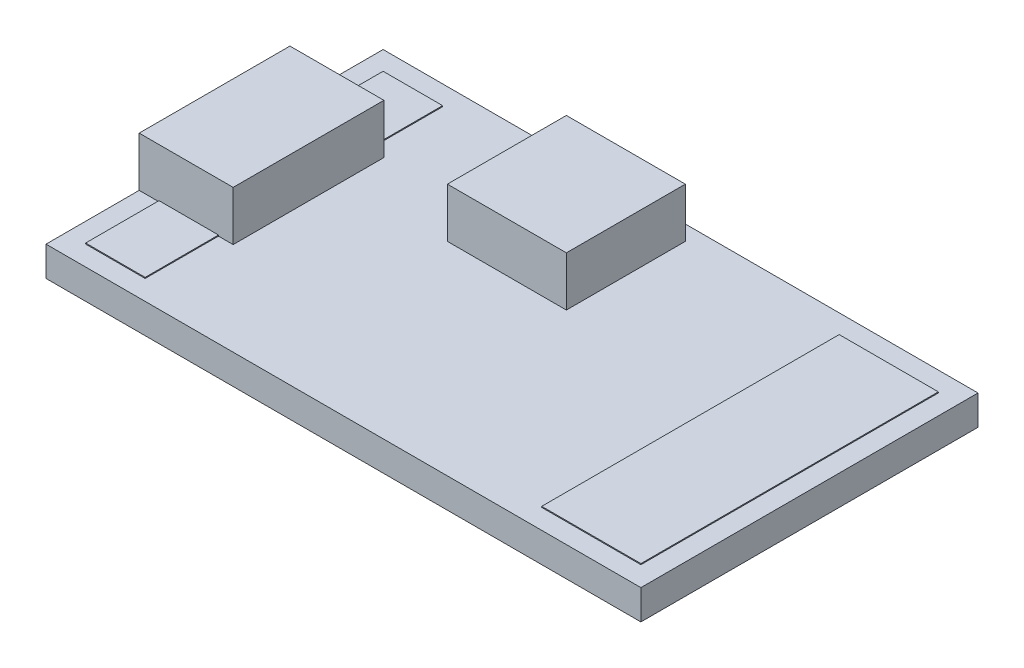
ISO-10303-21;
HEADER;
FILE_DESCRIPTION(('STEP AP214'),'2;1');
FILE_NAME('part.step','',(''),(''),'','','');
FILE_SCHEMA(('AUTOMOTIVE_DESIGN { 1 0 10303 214 1 1 1 1 }'));
ENDSEC;
DATA;
#1=APPLICATION_CONTEXT('core data for automotive mechanical design processes');
#2=APPLICATION_PROTOCOL_DEFINITION('international standard','automotive_design',2000,#1);
#3=PRODUCT_CONTEXT('',#1,'mechanical');
#4=PRODUCT('Part','Part','',(#3));
#5=PRODUCT_RELATED_PRODUCT_CATEGORY('part','',(#4));
#6=PRODUCT_DEFINITION_FORMATION('','',#4);
#7=PRODUCT_DEFINITION_CONTEXT('part definition',#1,'design');
#8=PRODUCT_DEFINITION('design','',#6,#7);
#9=PRODUCT_DEFINITION_SHAPE('','',#8);
#10=(LENGTH_UNIT() NAMED_UNIT(*) SI_UNIT(.MILLI.,.METRE.));
#11=(NAMED_UNIT(*) PLANE_ANGLE_UNIT() SI_UNIT($,.RADIAN.));
#12=(NAMED_UNIT(*) SI_UNIT($,.STERADIAN.) SOLID_ANGLE_UNIT());
#13=UNCERTAINTY_MEASURE_WITH_UNIT(LENGTH_MEASURE(1.E-05),#10,'distance_accuracy_value','');
#14=(GEOMETRIC_REPRESENTATION_CONTEXT(3) GLOBAL_UNCERTAINTY_ASSIGNED_CONTEXT((#13)) GLOBAL_UNIT_ASSIGNED_CONTEXT((#10,
#11,#12)) REPRESENTATION_CONTEXT('',''));
#15=CARTESIAN_POINT('',(0.,0.,0.));
#16=DIRECTION('',(0.,0.,1.));
#17=DIRECTION('',(1.,0.,0.));
#18=AXIS2_PLACEMENT_3D('',#15,#16,#17);
#19=CARTESIAN_POINT('',(0.,1.5,0.));
#20=DIRECTION('',(0.,-1.,0.));
#21=DIRECTION('',(0.,0.,-1.));
#22=AXIS2_PLACEMENT_3D('',#19,#20,#21);
#23=PLANE('',#22);
#24=DIRECTION('',(0.,0.,1.));
#25=VECTOR('',#24,1.);
#26=CARTESIAN_POINT('',(-20.,1.5,0.));
#27=LINE('',#26,#25);
#28=CARTESIAN_POINT('',(-20.,1.5,-7.74139549739495));
#29=VERTEX_POINT('',#28);
#30=CARTESIAN_POINT('',(-20.,1.5,-1.74139549739495));
#31=VERTEX_POINT('',#30);
#32=EDGE_CURVE('E344',#29,#31,#27,.T.);
#33=ORIENTED_EDGE('',*,*,#32,.F.);
#34=DIRECTION('',(-1.,0.,0.));
#35=VECTOR('',#34,1.);
#36=CARTESIAN_POINT('',(0.,1.5,-7.74139549739495));
#37=LINE('',#36,#35);
#38=CARTESIAN_POINT('',(-14.,1.5,-7.74139549739495));
#39=VERTEX_POINT('',#38);
#40=EDGE_CURVE('E335',#39,#29,#37,.T.);
#41=ORIENTED_EDGE('',*,*,#40,.F.);
#42=DIRECTION('',(0.,0.,-1.));
#43=VECTOR('',#42,1.);
#44=CARTESIAN_POINT('',(-14.,1.5,0.));
#45=LINE('',#44,#43);
#46=CARTESIAN_POINT('',(-14.,1.5,-1.74139549739495));
#47=VERTEX_POINT('',#46);
#48=EDGE_CURVE('E338',#47,#39,#45,.T.);
#49=ORIENTED_EDGE('',*,*,#48,.F.);
#50=DIRECTION('',(1.,0.,0.));
#51=VECTOR('',#50,1.);
#52=CARTESIAN_POINT('',(0.,1.5,-1.74139549739495));
#53=LINE('',#52,#51);
#54=EDGE_CURVE('E341',#31,#47,#53,.T.);
#55=ORIENTED_EDGE('',*,*,#54,.F.);
#56=EDGE_LOOP('',(#33,#41,#49,#55));
#57=FACE_BOUND('',#56,.T.);
#58=DIRECTION('',(1.,0.,0.));
#59=VECTOR('',#58,1.);
#60=CARTESIAN_POINT('',(0.,1.5,7.5));
#61=LINE('',#60,#59);
#62=CARTESIAN_POINT('',(-6.,1.5,7.5));
#63=VERTEX_POINT('',#62);
#64=CARTESIAN_POINT('',(-1.,1.5,7.5));
#65=VERTEX_POINT('',#64);
#66=EDGE_CURVE('E279',#63,#65,#61,.T.);
#67=ORIENTED_EDGE('',*,*,#66,.F.);
#68=DIRECTION('',(0.,0.,1.));
#69=VECTOR('',#68,1.);
#70=CARTESIAN_POINT('',(-6.,1.5,0.));
#71=LINE('',#70,#69);
#72=CARTESIAN_POINT('',(-6.,1.5,-7.5));
#73=VERTEX_POINT('',#72);
#74=EDGE_CURVE('E276',#73,#63,#71,.T.);
#75=ORIENTED_EDGE('',*,*,#74,.F.);
#76=DIRECTION('',(-1.,0.,0.));
#77=VECTOR('',#76,1.);
#78=CARTESIAN_POINT('',(0.,1.5,-7.5));
#79=LINE('',#78,#77);
#80=CARTESIAN_POINT('',(-1.,1.5,-7.5));
#81=VERTEX_POINT('',#80);
#82=EDGE_CURVE('E273',#81,#73,#79,.T.);
#83=ORIENTED_EDGE('',*,*,#82,.F.);
#84=DIRECTION('',(0.,0.,-1.));
#85=VECTOR('',#84,1.);
#86=CARTESIAN_POINT('',(-1.,1.5,0.));
#87=LINE('',#86,#85);
#88=EDGE_CURVE('E257',#65,#81,#87,.T.);
#89=ORIENTED_EDGE('',*,*,#88,.F.);
#90=EDGE_LOOP('',(#67,#75,#83,#89));
#91=FACE_BOUND('',#90,.T.);
#92=DIRECTION('',(0.,0.,-1.));
#93=VECTOR('',#92,1.);
#94=CARTESIAN_POINT('',(-26.,1.5,0.));
#95=LINE('',#94,#93);
#96=CARTESIAN_POINT('',(-26.,1.5,-3.80167065449123));
#97=VERTEX_POINT('',#96);
#98=CARTESIAN_POINT('',(-26.,1.5,-7.5));
#99=VERTEX_POINT('',#98);
#100=EDGE_CURVE('E215',#97,#99,#95,.T.);
#101=ORIENTED_EDGE('',*,*,#100,.F.);
#102=DIRECTION('',(-1.,0.,0.));
#103=VECTOR('',#102,1.);
#104=CARTESIAN_POINT('',(0.,1.5,-3.80167065449122));
#105=LINE('',#104,#103);
#106=CARTESIAN_POINT('',(-25.2605356148663,1.5,-3.80167065449123));
#107=VERTEX_POINT('',#106);
#108=EDGE_CURVE('E304',#107,#97,#105,.T.);
#109=ORIENTED_EDGE('',*,*,#108,.F.);
#110=DIRECTION('',(0.,0.,-1.));
#111=VECTOR('',#110,1.);
#112=CARTESIAN_POINT('',(-25.2605356148663,1.5,0.));
#113=LINE('',#112,#111);
#114=CARTESIAN_POINT('',(-25.2605356148663,1.5,3.80167065449123));
#115=VERTEX_POINT('',#114);
#116=EDGE_CURVE('E307',#115,#107,#113,.T.);
#117=ORIENTED_EDGE('',*,*,#116,.F.);
#118=DIRECTION('',(1.,0.,0.));
#119=VECTOR('',#118,1.);
#120=CARTESIAN_POINT('',(0.,1.5,3.80167065449122));
#121=LINE('',#120,#119);
#122=CARTESIAN_POINT('',(-26.,1.5,3.80167065449123));
#123=VERTEX_POINT('',#122);
#124=EDGE_CURVE('E310',#123,#115,#121,.T.);
#125=ORIENTED_EDGE('',*,*,#124,.F.);
#126=CARTESIAN_POINT('',(-26.,1.5,7.50000000000001));
#127=VERTEX_POINT('',#126);
#128=EDGE_CURVE('E239',#127,#123,#95,.T.);
#129=ORIENTED_EDGE('',*,*,#128,.F.);
#130=DIRECTION('',(1.,0.,0.));
#131=VECTOR('',#130,1.);
#132=CARTESIAN_POINT('',(0.,1.5,7.50000000000001));
#133=LINE('',#132,#131);
#134=CARTESIAN_POINT('',(-29.,1.5,7.50000000000001));
#135=VERTEX_POINT('',#134);
#136=EDGE_CURVE('E242',#135,#127,#133,.T.);
#137=ORIENTED_EDGE('',*,*,#136,.F.);
#138=DIRECTION('',(0.,0.,1.));
#139=VECTOR('',#138,1.);
#140=CARTESIAN_POINT('',(-29.,1.5,0.));
#141=LINE('',#140,#139);
#142=CARTESIAN_POINT('',(-29.,1.5,3.80167065449123));
#143=VERTEX_POINT('',#142);
#144=EDGE_CURVE('E234',#143,#135,#141,.T.);
#145=ORIENTED_EDGE('',*,*,#144,.F.);
#146=CARTESIAN_POINT('',(-30.,1.5,3.80167065449123));
#147=VERTEX_POINT('',#146);
#148=EDGE_CURVE('E311',#147,#143,#121,.T.);
#149=ORIENTED_EDGE('',*,*,#148,.F.);
#150=DIRECTION('',(0.,0.,1.));
#151=VECTOR('',#150,1.);
#152=CARTESIAN_POINT('',(-30.,1.5,-8.49999999999999));
#153=LINE('',#152,#151);
#154=CARTESIAN_POINT('',(-30.,1.5,8.5));
#155=VERTEX_POINT('',#154);
#156=EDGE_CURVE('E354',#147,#155,#153,.T.);
#157=ORIENTED_EDGE('',*,*,#156,.T.);
#158=DIRECTION('',(1.,0.,0.));
#159=VECTOR('',#158,1.);
#160=CARTESIAN_POINT('',(0.,1.5,8.5));
#161=LINE('',#160,#159);
#162=CARTESIAN_POINT('',(0.,1.5,8.5));
#163=VERTEX_POINT('',#162);
#164=EDGE_CURVE('E358',#155,#163,#161,.T.);
#165=ORIENTED_EDGE('',*,*,#164,.T.);
#166=DIRECTION('',(0.,0.,-1.));
#167=VECTOR('',#166,1.);
#168=CARTESIAN_POINT('',(0.,1.5,-8.5));
#169=LINE('',#168,#167);
#170=CARTESIAN_POINT('',(0.,1.5,-8.5));
#171=VERTEX_POINT('',#170);
#172=EDGE_CURVE('E348',#163,#171,#169,.T.);
#173=ORIENTED_EDGE('',*,*,#172,.T.);
#174=DIRECTION('',(-1.,0.,0.));
#175=VECTOR('',#174,1.);
#176=CARTESIAN_POINT('',(0.,1.5,-8.5));
#177=LINE('',#176,#175);
#178=CARTESIAN_POINT('',(-30.,1.5,-8.49999999999999));
#179=VERTEX_POINT('',#178);
#180=EDGE_CURVE('E351',#171,#179,#177,.T.);
#181=ORIENTED_EDGE('',*,*,#180,.T.);
#182=CARTESIAN_POINT('',(-30.,1.5,-3.80167065449123));
#183=VERTEX_POINT('',#182);
#184=EDGE_CURVE('E355',#179,#183,#153,.T.);
#185=ORIENTED_EDGE('',*,*,#184,.T.);
#186=CARTESIAN_POINT('',(-29.,1.5,-3.80167065449123));
#187=VERTEX_POINT('',#186);
#188=EDGE_CURVE('E303',#187,#183,#105,.T.);
#189=ORIENTED_EDGE('',*,*,#188,.F.);
#190=CARTESIAN_POINT('',(-29.,1.5,-7.5));
#191=VERTEX_POINT('',#190);
#192=EDGE_CURVE('E59',#191,#187,#141,.T.);
#193=ORIENTED_EDGE('',*,*,#192,.F.);
#194=DIRECTION('',(-1.,0.,0.));
#195=VECTOR('',#194,1.);
#196=CARTESIAN_POINT('',(0.,1.5,-7.5));
#197=LINE('',#196,#195);
#198=EDGE_CURVE('E54',#99,#191,#197,.T.);
#199=ORIENTED_EDGE('',*,*,#198,.F.);
#200=EDGE_LOOP('',(#101,#109,#117,#125,#129,#137,#145,#149,#157,#165,#173,#181,#185,#189,#193,#199));
#201=FACE_BOUND('',#200,.T.);
#202=ADVANCED_FACE('F39',(#57,#91,#201),#23,.F.);
#203=CARTESIAN_POINT('',(-30.,4.,3.80167065449123));
#204=DIRECTION('',(0.,0.,-1.));
#205=DIRECTION('',(-1.,0.,0.));
#206=AXIS2_PLACEMENT_3D('',#203,#204,#205);
#207=PLANE('',#206);
#208=DIRECTION('',(0.,1.,0.));
#209=VECTOR('',#208,1.);
#210=CARTESIAN_POINT('',(-26.,4.,3.80167065449123));
#211=LINE('',#210,#209);
#212=CARTESIAN_POINT('',(-26.,1.55,3.80167065449123));
#213=VERTEX_POINT('',#212);
#214=EDGE_CURVE('E238',#123,#213,#211,.T.);
#215=ORIENTED_EDGE('',*,*,#214,.F.);
#216=ORIENTED_EDGE('',*,*,#124,.T.);
#217=DIRECTION('',(0.,-1.,0.));
#218=VECTOR('',#217,1.);
#219=CARTESIAN_POINT('',(-25.2605356148663,4.,3.80167065449123));
#220=LINE('',#219,#218);
#221=CARTESIAN_POINT('',(-25.2605356148663,4.,3.80167065449123));
#222=VERTEX_POINT('',#221);
#223=EDGE_CURVE('E297',#222,#115,#220,.T.);
#224=ORIENTED_EDGE('',*,*,#223,.F.);
#225=DIRECTION('',(1.,0.,0.));
#226=VECTOR('',#225,1.);
#227=CARTESIAN_POINT('',(-30.,4.,3.80167065449123));
#228=LINE('',#227,#226);
#229=CARTESIAN_POINT('',(-30.,4.,3.80167065449123));
#230=VERTEX_POINT('',#229);
#231=EDGE_CURVE('E285',#230,#222,#228,.T.);
#232=ORIENTED_EDGE('',*,*,#231,.F.);
#233=DIRECTION('',(0.,-1.,0.));
#234=VECTOR('',#233,1.);
#235=CARTESIAN_POINT('',(-30.,4.,3.80167065449123));
#236=LINE('',#235,#234);
#237=EDGE_CURVE('E300',#230,#147,#236,.T.);
#238=ORIENTED_EDGE('',*,*,#237,.T.);
#239=ORIENTED_EDGE('',*,*,#148,.T.);
#240=DIRECTION('',(0.,-1.,0.));
#241=VECTOR('',#240,1.);
#242=CARTESIAN_POINT('',(-29.,4.,3.80167065449123));
#243=LINE('',#242,#241);
#244=CARTESIAN_POINT('',(-29.,1.55,3.80167065449123));
#245=VERTEX_POINT('',#244);
#246=EDGE_CURVE('E233',#245,#143,#243,.T.);
#247=ORIENTED_EDGE('',*,*,#246,.F.);
#248=DIRECTION('',(-1.,0.,0.));
#249=VECTOR('',#248,1.);
#250=CARTESIAN_POINT('',(-30.,1.55,3.80167065449123));
#251=LINE('',#250,#249);
#252=EDGE_CURVE('E228',#213,#245,#251,.T.);
#253=ORIENTED_EDGE('',*,*,#252,.F.);
#254=EDGE_LOOP('',(#215,#216,#224,#232,#238,#239,#247,#253));
#255=FACE_BOUND('',#254,.T.);
#256=ADVANCED_FACE('F404',(#255),#207,.F.);
#257=CARTESIAN_POINT('',(-30.,4.,-3.80167065449123));
#258=DIRECTION('',(0.,0.,1.));
#259=DIRECTION('',(1.,0.,0.));
#260=AXIS2_PLACEMENT_3D('',#257,#258,#259);
#261=PLANE('',#260);
#262=DIRECTION('',(0.,-1.,0.));
#263=VECTOR('',#262,1.);
#264=CARTESIAN_POINT('',(-26.,4.,-3.80167065449123));
#265=LINE('',#264,#263);
#266=CARTESIAN_POINT('',(-26.,1.55,-3.80167065449123));
#267=VERTEX_POINT('',#266);
#268=EDGE_CURVE('E12',#267,#97,#265,.T.);
#269=ORIENTED_EDGE('',*,*,#268,.F.);
#270=DIRECTION('',(1.,0.,0.));
#271=VECTOR('',#270,1.);
#272=CARTESIAN_POINT('',(-30.,1.55,-3.80167065449123));
#273=LINE('',#272,#271);
#274=CARTESIAN_POINT('',(-29.,1.55,-3.80167065449123));
#275=VERTEX_POINT('',#274);
#276=EDGE_CURVE('E207',#275,#267,#273,.T.);
#277=ORIENTED_EDGE('',*,*,#276,.F.);
#278=DIRECTION('',(0.,1.,0.));
#279=VECTOR('',#278,1.);
#280=CARTESIAN_POINT('',(-29.,4.,-3.80167065449123));
#281=LINE('',#280,#279);
#282=EDGE_CURVE('E47',#187,#275,#281,.T.);
#283=ORIENTED_EDGE('',*,*,#282,.F.);
#284=ORIENTED_EDGE('',*,*,#188,.T.);
#285=DIRECTION('',(0.,-1.,0.));
#286=VECTOR('',#285,1.);
#287=CARTESIAN_POINT('',(-30.,4.,-3.80167065449123));
#288=LINE('',#287,#286);
#289=CARTESIAN_POINT('',(-30.,4.,-3.80167065449123));
#290=VERTEX_POINT('',#289);
#291=EDGE_CURVE('E291',#290,#183,#288,.T.);
#292=ORIENTED_EDGE('',*,*,#291,.F.);
#293=DIRECTION('',(-1.,0.,0.));
#294=VECTOR('',#293,1.);
#295=CARTESIAN_POINT('',(-30.,4.,-3.80167065449123));
#296=LINE('',#295,#294);
#297=CARTESIAN_POINT('',(-25.2605356148663,4.,-3.80167065449123));
#298=VERTEX_POINT('',#297);
#299=EDGE_CURVE('E289',#298,#290,#296,.T.);
#300=ORIENTED_EDGE('',*,*,#299,.F.);
#301=DIRECTION('',(0.,-1.,0.));
#302=VECTOR('',#301,1.);
#303=CARTESIAN_POINT('',(-25.2605356148663,4.,-3.80167065449123));
#304=LINE('',#303,#302);
#305=EDGE_CURVE('E294',#298,#107,#304,.T.);
#306=ORIENTED_EDGE('',*,*,#305,.T.);
#307=ORIENTED_EDGE('',*,*,#108,.T.);
#308=EDGE_LOOP('',(#269,#277,#283,#284,#292,#300,#306,#307));
#309=FACE_BOUND('',#308,.T.);
#310=ADVANCED_FACE('F422',(#309),#261,.F.);
#311=CARTESIAN_POINT('',(0.,1.5,-8.5));
#312=DIRECTION('',(-1.,0.,0.));
#313=DIRECTION('',(0.,0.,1.));
#314=AXIS2_PLACEMENT_3D('',#311,#312,#313);
#315=PLANE('',#314);
#316=DIRECTION('',(0.,0.,-1.));
#317=VECTOR('',#316,1.);
#318=CARTESIAN_POINT('',(0.,0.,-8.5));
#319=LINE('',#318,#317);
#320=CARTESIAN_POINT('',(0.,0.,8.5));
#321=VERTEX_POINT('',#320);
#322=CARTESIAN_POINT('',(0.,0.,-8.5));
#323=VERTEX_POINT('',#322);
#324=EDGE_CURVE('E347',#321,#323,#319,.T.);
#325=ORIENTED_EDGE('',*,*,#324,.T.);
#326=DIRECTION('',(0.,-1.,0.));
#327=VECTOR('',#326,1.);
#328=CARTESIAN_POINT('',(0.,1.5,-8.5));
#329=LINE('',#328,#327);
#330=EDGE_CURVE('E376',#171,#323,#329,.T.);
#331=ORIENTED_EDGE('',*,*,#330,.F.);
#332=ORIENTED_EDGE('',*,*,#172,.F.);
#333=DIRECTION('',(0.,-1.,0.));
#334=VECTOR('',#333,1.);
#335=CARTESIAN_POINT('',(0.,1.5,8.5));
#336=LINE('',#335,#334);
#337=EDGE_CURVE('E360',#163,#321,#336,.T.);
#338=ORIENTED_EDGE('',*,*,#337,.T.);
#339=EDGE_LOOP('',(#325,#331,#332,#338));
#340=FACE_BOUND('',#339,.T.);
#341=ADVANCED_FACE('F41',(#340),#315,.F.);
#342=CARTESIAN_POINT('',(0.,1.5,-8.5));
#343=DIRECTION('',(0.,0.,1.));
#344=DIRECTION('',(1.,0.,0.));
#345=AXIS2_PLACEMENT_3D('',#342,#343,#344);
#346=PLANE('',#345);
#347=DIRECTION('',(-1.,0.,0.));
#348=VECTOR('',#347,1.);
#349=CARTESIAN_POINT('',(0.,0.,-8.5));
#350=LINE('',#349,#348);
#351=CARTESIAN_POINT('',(-30.,0.,-8.49999999999999));
#352=VERTEX_POINT('',#351);
#353=EDGE_CURVE('E363',#323,#352,#350,.T.);
#354=ORIENTED_EDGE('',*,*,#353,.T.);
#355=DIRECTION('',(0.,-1.,0.));
#356=VECTOR('',#355,1.);
#357=CARTESIAN_POINT('',(-30.,1.5,-8.49999999999999));
#358=LINE('',#357,#356);
#359=EDGE_CURVE('E373',#179,#352,#358,.T.);
#360=ORIENTED_EDGE('',*,*,#359,.F.);
#361=ORIENTED_EDGE('',*,*,#180,.F.);
#362=ORIENTED_EDGE('',*,*,#330,.T.);
#363=EDGE_LOOP('',(#354,#360,#361,#362));
#364=FACE_BOUND('',#363,.T.);
#365=ADVANCED_FACE('F439',(#364),#346,.F.);
#366=CARTESIAN_POINT('',(-30.,1.5,-8.49999999999999));
#367=DIRECTION('',(1.,0.,0.));
#368=DIRECTION('',(0.,0.,-1.));
#369=AXIS2_PLACEMENT_3D('',#366,#367,#368);
#370=PLANE('',#369);
#371=DIRECTION('',(0.,0.,1.));
#372=VECTOR('',#371,1.);
#373=CARTESIAN_POINT('',(-30.,0.,-8.49999999999999));
#374=LINE('',#373,#372);
#375=CARTESIAN_POINT('',(-30.,0.,8.5));
#376=VERTEX_POINT('',#375);
#377=EDGE_CURVE('E365',#352,#376,#374,.T.);
#378=ORIENTED_EDGE('',*,*,#377,.T.);
#379=DIRECTION('',(0.,-1.,0.));
#380=VECTOR('',#379,1.);
#381=CARTESIAN_POINT('',(-30.,1.5,8.5));
#382=LINE('',#381,#380);
#383=EDGE_CURVE('E370',#155,#376,#382,.T.);
#384=ORIENTED_EDGE('',*,*,#383,.F.);
#385=ORIENTED_EDGE('',*,*,#156,.F.);
#386=ORIENTED_EDGE('',*,*,#237,.F.);
#387=DIRECTION('',(0.,0.,1.));
#388=VECTOR('',#387,1.);
#389=CARTESIAN_POINT('',(-30.,4.,-3.80167065449123));
#390=LINE('',#389,#388);
#391=EDGE_CURVE('E282',#290,#230,#390,.T.);
#392=ORIENTED_EDGE('',*,*,#391,.F.);
#393=ORIENTED_EDGE('',*,*,#291,.T.);
#394=ORIENTED_EDGE('',*,*,#184,.F.);
#395=ORIENTED_EDGE('',*,*,#359,.T.);
#396=EDGE_LOOP('',(#378,#384,#385,#386,#392,#393,#394,#395));
#397=FACE_BOUND('',#396,.T.);
#398=ADVANCED_FACE('F436',(#397),#370,.F.);
#399=CARTESIAN_POINT('',(0.,1.5,8.5));
#400=DIRECTION('',(0.,0.,-1.));
#401=DIRECTION('',(-1.,0.,0.));
#402=AXIS2_PLACEMENT_3D('',#399,#400,#401);
#403=PLANE('',#402);
#404=DIRECTION('',(1.,0.,0.));
#405=VECTOR('',#404,1.);
#406=CARTESIAN_POINT('',(0.,0.,8.5));
#407=LINE('',#406,#405);
#408=EDGE_CURVE('E352',#376,#321,#407,.T.);
#409=ORIENTED_EDGE('',*,*,#408,.T.);
#410=ORIENTED_EDGE('',*,*,#337,.F.);
#411=ORIENTED_EDGE('',*,*,#164,.F.);
#412=ORIENTED_EDGE('',*,*,#383,.T.);
#413=EDGE_LOOP('',(#409,#410,#411,#412));
#414=FACE_BOUND('',#413,.T.);
#415=ADVANCED_FACE('F432',(#414),#403,.F.);
#416=CARTESIAN_POINT('',(0.,0.,0.));
#417=DIRECTION('',(0.,-1.,0.));
#418=DIRECTION('',(0.,0.,-1.));
#419=AXIS2_PLACEMENT_3D('',#416,#417,#418);
#420=PLANE('',#419);
#421=ORIENTED_EDGE('',*,*,#408,.F.);
#422=ORIENTED_EDGE('',*,*,#377,.F.);
#423=ORIENTED_EDGE('',*,*,#353,.F.);
#424=ORIENTED_EDGE('',*,*,#324,.F.);
#425=EDGE_LOOP('',(#421,#422,#423,#424));
#426=FACE_BOUND('',#425,.T.);
#427=ADVANCED_FACE('F429',(#426),#420,.T.);
#428=CARTESIAN_POINT('',(-20.,4.,-7.74139549739495));
#429=DIRECTION('',(1.,0.,0.));
#430=DIRECTION('',(0.,0.,-1.));
#431=AXIS2_PLACEMENT_3D('',#428,#429,#430);
#432=PLANE('',#431);
#433=DIRECTION('',(0.,-1.,0.));
#434=VECTOR('',#433,1.);
#435=CARTESIAN_POINT('',(-20.,4.,-7.74139549739495));
#436=LINE('',#435,#434);
#437=CARTESIAN_POINT('',(-20.,4.,-7.74139549739495));
#438=VERTEX_POINT('',#437);
#439=EDGE_CURVE('E323',#438,#29,#436,.T.);
#440=ORIENTED_EDGE('',*,*,#439,.T.);
#441=ORIENTED_EDGE('',*,*,#32,.T.);
#442=DIRECTION('',(0.,-1.,0.));
#443=VECTOR('',#442,1.);
#444=CARTESIAN_POINT('',(-20.,4.,-1.74139549739495));
#445=LINE('',#444,#443);
#446=CARTESIAN_POINT('',(-20.,4.,-1.74139549739495));
#447=VERTEX_POINT('',#446);
#448=EDGE_CURVE('E332',#447,#31,#445,.T.);
#449=ORIENTED_EDGE('',*,*,#448,.F.);
#450=DIRECTION('',(0.,0.,1.));
#451=VECTOR('',#450,1.);
#452=CARTESIAN_POINT('',(-20.,4.,-7.74139549739495));
#453=LINE('',#452,#451);
#454=EDGE_CURVE('E314',#438,#447,#453,.T.);
#455=ORIENTED_EDGE('',*,*,#454,.F.);
#456=EDGE_LOOP('',(#440,#441,#449,#455));
#457=FACE_BOUND('',#456,.T.);
#458=ADVANCED_FACE('F427',(#457),#432,.F.);
#459=CARTESIAN_POINT('',(-20.,4.,-1.74139549739495));
#460=DIRECTION('',(0.,0.,-1.));
#461=DIRECTION('',(-1.,0.,0.));
#462=AXIS2_PLACEMENT_3D('',#459,#460,#461);
#463=PLANE('',#462);
#464=ORIENTED_EDGE('',*,*,#448,.T.);
#465=ORIENTED_EDGE('',*,*,#54,.T.);
#466=DIRECTION('',(0.,-1.,0.));
#467=VECTOR('',#466,1.);
#468=CARTESIAN_POINT('',(-14.,4.,-1.74139549739495));
#469=LINE('',#468,#467);
#470=CARTESIAN_POINT('',(-14.,4.,-1.74139549739495));
#471=VERTEX_POINT('',#470);
#472=EDGE_CURVE('E329',#471,#47,#469,.T.);
#473=ORIENTED_EDGE('',*,*,#472,.F.);
#474=DIRECTION('',(1.,0.,0.));
#475=VECTOR('',#474,1.);
#476=CARTESIAN_POINT('',(-20.,4.,-1.74139549739495));
#477=LINE('',#476,#475);
#478=EDGE_CURVE('E317',#447,#471,#477,.T.);
#479=ORIENTED_EDGE('',*,*,#478,.F.);
#480=EDGE_LOOP('',(#464,#465,#473,#479));
#481=FACE_BOUND('',#480,.T.);
#482=ADVANCED_FACE('F489',(#481),#463,.F.);
#483=CARTESIAN_POINT('',(-14.,4.,-7.74139549739495));
#484=DIRECTION('',(-1.,0.,0.));
#485=DIRECTION('',(0.,0.,1.));
#486=AXIS2_PLACEMENT_3D('',#483,#484,#485);
#487=PLANE('',#486);
#488=ORIENTED_EDGE('',*,*,#472,.T.);
#489=ORIENTED_EDGE('',*,*,#48,.T.);
#490=DIRECTION('',(0.,-1.,0.));
#491=VECTOR('',#490,1.);
#492=CARTESIAN_POINT('',(-14.,4.,-7.74139549739495));
#493=LINE('',#492,#491);
#494=CARTESIAN_POINT('',(-14.,4.,-7.74139549739495));
#495=VERTEX_POINT('',#494);
#496=EDGE_CURVE('E326',#495,#39,#493,.T.);
#497=ORIENTED_EDGE('',*,*,#496,.F.);
#498=DIRECTION('',(0.,0.,-1.));
#499=VECTOR('',#498,1.);
#500=CARTESIAN_POINT('',(-14.,4.,-7.74139549739495));
#501=LINE('',#500,#499);
#502=EDGE_CURVE('E319',#471,#495,#501,.T.);
#503=ORIENTED_EDGE('',*,*,#502,.F.);
#504=EDGE_LOOP('',(#488,#489,#497,#503));
#505=FACE_BOUND('',#504,.T.);
#506=ADVANCED_FACE('F486',(#505),#487,.F.);
#507=CARTESIAN_POINT('',(-20.,4.,-7.74139549739495));
#508=DIRECTION('',(0.,0.,1.));
#509=DIRECTION('',(1.,0.,0.));
#510=AXIS2_PLACEMENT_3D('',#507,#508,#509);
#511=PLANE('',#510);
#512=ORIENTED_EDGE('',*,*,#496,.T.);
#513=ORIENTED_EDGE('',*,*,#40,.T.);
#514=ORIENTED_EDGE('',*,*,#439,.F.);
#515=DIRECTION('',(-1.,0.,0.));
#516=VECTOR('',#515,1.);
#517=CARTESIAN_POINT('',(-20.,4.,-7.74139549739495));
#518=LINE('',#517,#516);
#519=EDGE_CURVE('E321',#495,#438,#518,.T.);
#520=ORIENTED_EDGE('',*,*,#519,.F.);
#521=EDGE_LOOP('',(#512,#513,#514,#520));
#522=FACE_BOUND('',#521,.T.);
#523=ADVANCED_FACE('F479',(#522),#511,.F.);
#524=CARTESIAN_POINT('',(0.,4.,0.));
#525=DIRECTION('',(0.,1.,0.));
#526=DIRECTION('',(0.,0.,1.));
#527=AXIS2_PLACEMENT_3D('',#524,#525,#526);
#528=PLANE('',#527);
#529=ORIENTED_EDGE('',*,*,#454,.T.);
#530=ORIENTED_EDGE('',*,*,#478,.T.);
#531=ORIENTED_EDGE('',*,*,#502,.T.);
#532=ORIENTED_EDGE('',*,*,#519,.T.);
#533=EDGE_LOOP('',(#529,#530,#531,#532));
#534=FACE_BOUND('',#533,.T.);
#535=ADVANCED_FACE('F471',(#534),#528,.T.);
#536=CARTESIAN_POINT('',(-25.2605356148663,4.,-3.80167065449123));
#537=DIRECTION('',(-1.,0.,0.));
#538=DIRECTION('',(0.,0.,1.));
#539=AXIS2_PLACEMENT_3D('',#536,#537,#538);
#540=PLANE('',#539);
#541=ORIENTED_EDGE('',*,*,#223,.T.);
#542=ORIENTED_EDGE('',*,*,#116,.T.);
#543=ORIENTED_EDGE('',*,*,#305,.F.);
#544=DIRECTION('',(0.,0.,-1.));
#545=VECTOR('',#544,1.);
#546=CARTESIAN_POINT('',(-25.2605356148663,4.,-3.80167065449123));
#547=LINE('',#546,#545);
#548=EDGE_CURVE('E287',#222,#298,#547,.T.);
#549=ORIENTED_EDGE('',*,*,#548,.F.);
#550=EDGE_LOOP('',(#541,#542,#543,#549));
#551=FACE_BOUND('',#550,.T.);
#552=ADVANCED_FACE('F468',(#551),#540,.F.);
#553=CARTESIAN_POINT('',(0.,4.,0.));
#554=DIRECTION('',(0.,1.,0.));
#555=DIRECTION('',(0.,0.,1.));
#556=AXIS2_PLACEMENT_3D('',#553,#554,#555);
#557=PLANE('',#556);
#558=ORIENTED_EDGE('',*,*,#391,.T.);
#559=ORIENTED_EDGE('',*,*,#231,.T.);
#560=ORIENTED_EDGE('',*,*,#548,.T.);
#561=ORIENTED_EDGE('',*,*,#299,.T.);
#562=EDGE_LOOP('',(#558,#559,#560,#561));
#563=FACE_BOUND('',#562,.T.);
#564=ADVANCED_FACE('F463',(#563),#557,.T.);
#565=CARTESIAN_POINT('',(-1.,17.4113883008419,7.5));
#566=DIRECTION('',(0.,0.,-1.));
#567=DIRECTION('',(-1.,0.,0.));
#568=AXIS2_PLACEMENT_3D('',#565,#566,#567);
#569=PLANE('',#568);
#570=DIRECTION('',(0.,-1.,0.));
#571=VECTOR('',#570,1.);
#572=CARTESIAN_POINT('',(-6.,17.4113883008419,7.5));
#573=LINE('',#572,#571);
#574=CARTESIAN_POINT('',(-6.,1.55,7.5));
#575=VERTEX_POINT('',#574);
#576=EDGE_CURVE('E260',#575,#63,#573,.T.);
#577=ORIENTED_EDGE('',*,*,#576,.T.);
#578=ORIENTED_EDGE('',*,*,#66,.T.);
#579=DIRECTION('',(0.,-1.,0.));
#580=VECTOR('',#579,1.);
#581=CARTESIAN_POINT('',(-1.,17.4113883008419,7.5));
#582=LINE('',#581,#580);
#583=CARTESIAN_POINT('',(-1.,1.55,7.5));
#584=VERTEX_POINT('',#583);
#585=EDGE_CURVE('E246',#584,#65,#582,.T.);
#586=ORIENTED_EDGE('',*,*,#585,.F.);
#587=DIRECTION('',(-1.,0.,0.));
#588=VECTOR('',#587,1.);
#589=CARTESIAN_POINT('',(-1.,1.55,7.5));
#590=LINE('',#589,#588);
#591=EDGE_CURVE('E251',#584,#575,#590,.T.);
#592=ORIENTED_EDGE('',*,*,#591,.T.);
#593=EDGE_LOOP('',(#577,#578,#586,#592));
#594=FACE_BOUND('',#593,.T.);
#595=ADVANCED_FACE('F477',(#594),#569,.F.);
#596=CARTESIAN_POINT('',(-6.,17.4113883008419,-7.5));
#597=DIRECTION('',(1.,0.,0.));
#598=DIRECTION('',(0.,0.,-1.));
#599=AXIS2_PLACEMENT_3D('',#596,#597,#598);
#600=PLANE('',#599);
#601=DIRECTION('',(0.,-1.,0.));
#602=VECTOR('',#601,1.);
#603=CARTESIAN_POINT('',(-6.,17.4113883008419,-7.5));
#604=LINE('',#603,#602);
#605=CARTESIAN_POINT('',(-6.,1.55,-7.5));
#606=VERTEX_POINT('',#605);
#607=EDGE_CURVE('E263',#606,#73,#604,.T.);
#608=ORIENTED_EDGE('',*,*,#607,.T.);
#609=ORIENTED_EDGE('',*,*,#74,.T.);
#610=ORIENTED_EDGE('',*,*,#576,.F.);
#611=DIRECTION('',(0.,0.,-1.));
#612=VECTOR('',#611,1.);
#613=CARTESIAN_POINT('',(-6.,1.55,-7.5));
#614=LINE('',#613,#612);
#615=EDGE_CURVE('E247',#575,#606,#614,.T.);
#616=ORIENTED_EDGE('',*,*,#615,.T.);
#617=EDGE_LOOP('',(#608,#609,#610,#616));
#618=FACE_BOUND('',#617,.T.);
#619=ADVANCED_FACE('F579',(#618),#600,.F.);
#620=CARTESIAN_POINT('',(-1.,17.4113883008419,-7.5));
#621=DIRECTION('',(0.,0.,1.));
#622=DIRECTION('',(1.,0.,0.));
#623=AXIS2_PLACEMENT_3D('',#620,#621,#622);
#624=PLANE('',#623);
#625=DIRECTION('',(0.,-1.,0.));
#626=VECTOR('',#625,1.);
#627=CARTESIAN_POINT('',(-1.,17.4113883008419,-7.5));
#628=LINE('',#627,#626);
#629=CARTESIAN_POINT('',(-1.,1.55,-7.5));
#630=VERTEX_POINT('',#629);
#631=EDGE_CURVE('E266',#630,#81,#628,.T.);
#632=ORIENTED_EDGE('',*,*,#631,.T.);
#633=ORIENTED_EDGE('',*,*,#82,.T.);
#634=ORIENTED_EDGE('',*,*,#607,.F.);
#635=DIRECTION('',(1.,0.,0.));
#636=VECTOR('',#635,1.);
#637=CARTESIAN_POINT('',(-1.,1.55,-7.5));
#638=LINE('',#637,#636);
#639=EDGE_CURVE('E250',#606,#630,#638,.T.);
#640=ORIENTED_EDGE('',*,*,#639,.T.);
#641=EDGE_LOOP('',(#632,#633,#634,#640));
#642=FACE_BOUND('',#641,.T.);
#643=ADVANCED_FACE('F588',(#642),#624,.F.);
#644=CARTESIAN_POINT('',(-1.,17.4113883008419,-7.5));
#645=DIRECTION('',(-1.,0.,0.));
#646=DIRECTION('',(0.,0.,1.));
#647=AXIS2_PLACEMENT_3D('',#644,#645,#646);
#648=PLANE('',#647);
#649=ORIENTED_EDGE('',*,*,#585,.T.);
#650=ORIENTED_EDGE('',*,*,#88,.T.);
#651=ORIENTED_EDGE('',*,*,#631,.F.);
#652=DIRECTION('',(0.,0.,1.));
#653=VECTOR('',#652,1.);
#654=CARTESIAN_POINT('',(-1.,1.55,-7.5));
#655=LINE('',#654,#653);
#656=EDGE_CURVE('E254',#630,#584,#655,.T.);
#657=ORIENTED_EDGE('',*,*,#656,.T.);
#658=EDGE_LOOP('',(#649,#650,#651,#657));
#659=FACE_BOUND('',#658,.T.);
#660=ADVANCED_FACE('F597',(#659),#648,.F.);
#661=CARTESIAN_POINT('',(0.,1.55,0.));
#662=DIRECTION('',(0.,-1.,0.));
#663=DIRECTION('',(0.,0.,-1.));
#664=AXIS2_PLACEMENT_3D('',#661,#662,#663);
#665=PLANE('',#664);
#666=ORIENTED_EDGE('',*,*,#639,.F.);
#667=ORIENTED_EDGE('',*,*,#615,.F.);
#668=ORIENTED_EDGE('',*,*,#591,.F.);
#669=ORIENTED_EDGE('',*,*,#656,.F.);
#670=EDGE_LOOP('',(#666,#667,#668,#669));
#671=FACE_BOUND('',#670,.T.);
#672=ADVANCED_FACE('F415',(#671),#665,.F.);
#673=CARTESIAN_POINT('',(0.,1.55,0.));
#674=DIRECTION('',(0.,-1.,0.));
#675=DIRECTION('',(0.,0.,-1.));
#676=AXIS2_PLACEMENT_3D('',#673,#674,#675);
#677=PLANE('',#676);
#678=DIRECTION('',(0.,0.,-1.));
#679=VECTOR('',#678,1.);
#680=CARTESIAN_POINT('',(-29.,1.55,-7.5));
#681=LINE('',#680,#679);
#682=CARTESIAN_POINT('',(-29.,1.55,-7.5));
#683=VERTEX_POINT('',#682);
#684=EDGE_CURVE('E382',#275,#683,#681,.T.);
#685=ORIENTED_EDGE('',*,*,#684,.F.);
#686=ORIENTED_EDGE('',*,*,#276,.T.);
#687=DIRECTION('',(0.,0.,1.));
#688=VECTOR('',#687,1.);
#689=CARTESIAN_POINT('',(-26.,1.55,-7.5));
#690=LINE('',#689,#688);
#691=CARTESIAN_POINT('',(-26.,1.55,-7.5));
#692=VERTEX_POINT('',#691);
#693=EDGE_CURVE('E200',#692,#267,#690,.T.);
#694=ORIENTED_EDGE('',*,*,#693,.F.);
#695=DIRECTION('',(1.,0.,0.));
#696=VECTOR('',#695,1.);
#697=CARTESIAN_POINT('',(-29.,1.55,-7.5));
#698=LINE('',#697,#696);
#699=EDGE_CURVE('E205',#683,#692,#698,.T.);
#700=ORIENTED_EDGE('',*,*,#699,.F.);
#701=EDGE_LOOP('',(#685,#686,#694,#700));
#702=FACE_BOUND('',#701,.T.);
#703=ADVANCED_FACE('F203',(#702),#677,.F.);
#704=CARTESIAN_POINT('',(-29.,17.4113883008419,-7.5));
#705=DIRECTION('',(1.,0.,0.));
#706=DIRECTION('',(0.,0.,-1.));
#707=AXIS2_PLACEMENT_3D('',#704,#705,#706);
#708=PLANE('',#707);
#709=DIRECTION('',(0.,-1.,0.));
#710=VECTOR('',#709,1.);
#711=CARTESIAN_POINT('',(-29.,17.4113883008419,-7.5));
#712=LINE('',#711,#710);
#713=EDGE_CURVE('E218',#683,#191,#712,.T.);
#714=ORIENTED_EDGE('',*,*,#713,.T.);
#715=ORIENTED_EDGE('',*,*,#192,.T.);
#716=ORIENTED_EDGE('',*,*,#282,.T.);
#717=ORIENTED_EDGE('',*,*,#684,.T.);
#718=EDGE_LOOP('',(#714,#715,#716,#717));
#719=FACE_BOUND('',#718,.T.);
#720=ADVANCED_FACE('F381',(#719),#708,.F.);
#721=CARTESIAN_POINT('',(-26.,17.4113883008419,-7.5));
#722=DIRECTION('',(-1.,0.,0.));
#723=DIRECTION('',(0.,0.,1.));
#724=AXIS2_PLACEMENT_3D('',#721,#722,#723);
#725=PLANE('',#724);
#726=ORIENTED_EDGE('',*,*,#268,.T.);
#727=ORIENTED_EDGE('',*,*,#100,.T.);
#728=DIRECTION('',(0.,-1.,0.));
#729=VECTOR('',#728,1.);
#730=CARTESIAN_POINT('',(-26.,17.4113883008419,-7.5));
#731=LINE('',#730,#729);
#732=EDGE_CURVE('E213',#692,#99,#731,.T.);
#733=ORIENTED_EDGE('',*,*,#732,.F.);
#734=ORIENTED_EDGE('',*,*,#693,.T.);
#735=EDGE_LOOP('',(#726,#727,#733,#734));
#736=FACE_BOUND('',#735,.T.);
#737=ADVANCED_FACE('F214',(#736),#725,.F.);
#738=CARTESIAN_POINT('',(-29.,17.4113883008419,-7.5));
#739=DIRECTION('',(0.,0.,1.));
#740=DIRECTION('',(1.,0.,0.));
#741=AXIS2_PLACEMENT_3D('',#738,#739,#740);
#742=PLANE('',#741);
#743=ORIENTED_EDGE('',*,*,#732,.T.);
#744=ORIENTED_EDGE('',*,*,#198,.T.);
#745=ORIENTED_EDGE('',*,*,#713,.F.);
#746=ORIENTED_EDGE('',*,*,#699,.T.);
#747=EDGE_LOOP('',(#743,#744,#745,#746));
#748=FACE_BOUND('',#747,.T.);
#749=ADVANCED_FACE('F220',(#748),#742,.F.);
#750=CARTESIAN_POINT('',(-29.,17.4113883008419,7.50000000000001));
#751=DIRECTION('',(0.,0.,-1.));
#752=DIRECTION('',(-1.,0.,0.));
#753=AXIS2_PLACEMENT_3D('',#750,#751,#752);
#754=PLANE('',#753);
#755=DIRECTION('',(0.,-1.,0.));
#756=VECTOR('',#755,1.);
#757=CARTESIAN_POINT('',(-29.,17.4113883008419,7.50000000000001));
#758=LINE('',#757,#756);
#759=CARTESIAN_POINT('',(-29.,1.55,7.50000000000001));
#760=VERTEX_POINT('',#759);
#761=EDGE_CURVE('E222',#760,#135,#758,.T.);
#762=ORIENTED_EDGE('',*,*,#761,.T.);
#763=ORIENTED_EDGE('',*,*,#136,.T.);
#764=DIRECTION('',(0.,-1.,0.));
#765=VECTOR('',#764,1.);
#766=CARTESIAN_POINT('',(-26.,17.4113883008419,7.50000000000001));
#767=LINE('',#766,#765);
#768=CARTESIAN_POINT('',(-26.,1.55,7.50000000000001));
#769=VERTEX_POINT('',#768);
#770=EDGE_CURVE('E217',#769,#127,#767,.T.);
#771=ORIENTED_EDGE('',*,*,#770,.F.);
#772=DIRECTION('',(-1.,0.,0.));
#773=VECTOR('',#772,1.);
#774=CARTESIAN_POINT('',(-29.,1.55,7.50000000000001));
#775=LINE('',#774,#773);
#776=EDGE_CURVE('E209',#769,#760,#775,.T.);
#777=ORIENTED_EDGE('',*,*,#776,.T.);
#778=EDGE_LOOP('',(#762,#763,#771,#777));
#779=FACE_BOUND('',#778,.T.);
#780=ADVANCED_FACE('F397',(#779),#754,.F.);
#781=ORIENTED_EDGE('',*,*,#770,.T.);
#782=ORIENTED_EDGE('',*,*,#128,.T.);
#783=ORIENTED_EDGE('',*,*,#214,.T.);
#784=EDGE_CURVE('E210',#213,#769,#690,.T.);
#785=ORIENTED_EDGE('',*,*,#784,.T.);
#786=EDGE_LOOP('',(#781,#782,#783,#785));
#787=FACE_BOUND('',#786,.T.);
#788=ADVANCED_FACE('F393',(#787),#725,.F.);
#789=ORIENTED_EDGE('',*,*,#246,.T.);
#790=ORIENTED_EDGE('',*,*,#144,.T.);
#791=ORIENTED_EDGE('',*,*,#761,.F.);
#792=EDGE_CURVE('E231',#760,#245,#681,.T.);
#793=ORIENTED_EDGE('',*,*,#792,.T.);
#794=EDGE_LOOP('',(#789,#790,#791,#793));
#795=FACE_BOUND('',#794,.T.);
#796=ADVANCED_FACE('F402',(#795),#708,.F.);
#797=ORIENTED_EDGE('',*,*,#784,.F.);
#798=ORIENTED_EDGE('',*,*,#252,.T.);
#799=ORIENTED_EDGE('',*,*,#792,.F.);
#800=ORIENTED_EDGE('',*,*,#776,.F.);
#801=EDGE_LOOP('',(#797,#798,#799,#800));
#802=FACE_BOUND('',#801,.T.);
#803=ADVANCED_FACE('F406',(#802),#677,.F.);
#804=CLOSED_SHELL('',(#202,#256,#310,#341,#365,#398,#415,#427,#458,#482,#506,#523,#535,#552,
#564,#595,#619,#643,#660,#672,#703,#720,#737,#749,#780,#788,#796,#803));
#805=MANIFOLD_SOLID_BREP('B2',#804);
#806=ADVANCED_BREP_SHAPE_REPRESENTATION('',(#18,#805),#14);
#807=SHAPE_DEFINITION_REPRESENTATION(#9,#806);
ENDSEC;
END-ISO-10303-21;
